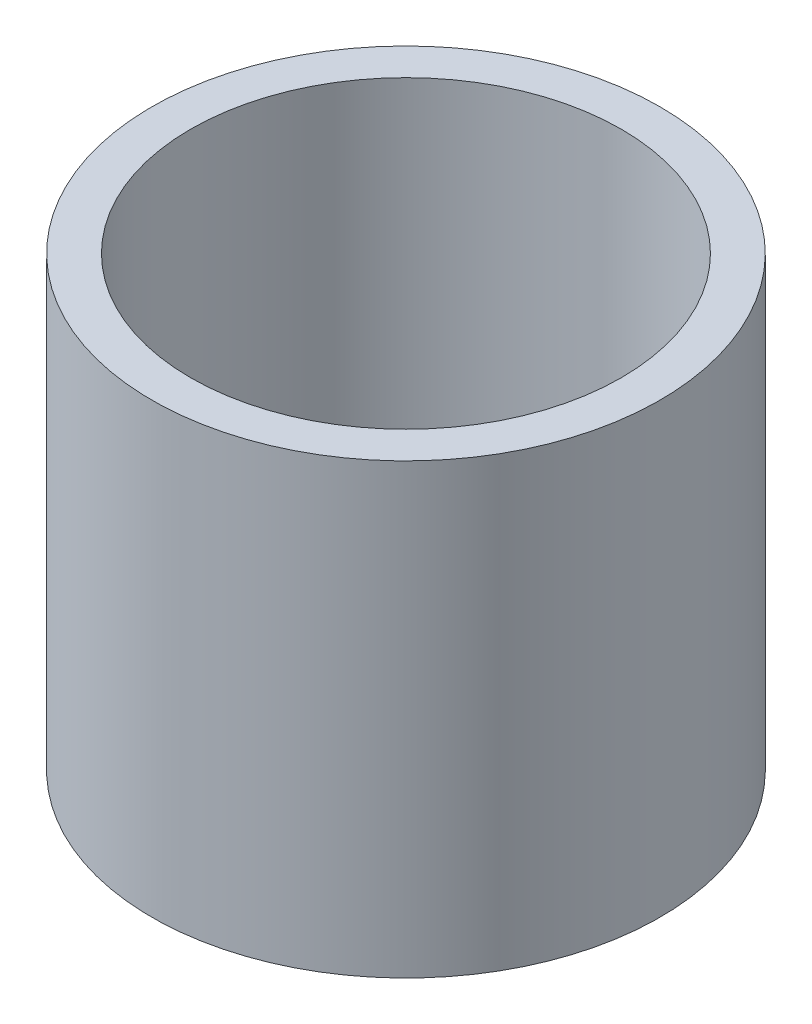
ISO-10303-21;
HEADER;
FILE_DESCRIPTION(('STEP AP214'),'2;1');
FILE_NAME('part.step','',(''),(''),'','','');
FILE_SCHEMA(('AUTOMOTIVE_DESIGN { 1 0 10303 214 1 1 1 1 }'));
ENDSEC;
DATA;
#1=APPLICATION_CONTEXT('core data for automotive mechanical design processes');
#2=APPLICATION_PROTOCOL_DEFINITION('international standard','automotive_design',2000,#1);
#3=PRODUCT_CONTEXT('',#1,'mechanical');
#4=PRODUCT('Part','Part','',(#3));
#5=PRODUCT_RELATED_PRODUCT_CATEGORY('part','',(#4));
#6=PRODUCT_DEFINITION_FORMATION('','',#4);
#7=PRODUCT_DEFINITION_CONTEXT('part definition',#1,'design');
#8=PRODUCT_DEFINITION('design','',#6,#7);
#9=PRODUCT_DEFINITION_SHAPE('','',#8);
#10=(LENGTH_UNIT() NAMED_UNIT(*) SI_UNIT(.MILLI.,.METRE.));
#11=(NAMED_UNIT(*) PLANE_ANGLE_UNIT() SI_UNIT($,.RADIAN.));
#12=(NAMED_UNIT(*) SI_UNIT($,.STERADIAN.) SOLID_ANGLE_UNIT());
#13=UNCERTAINTY_MEASURE_WITH_UNIT(LENGTH_MEASURE(1.E-05),#10,'distance_accuracy_value','');
#14=(GEOMETRIC_REPRESENTATION_CONTEXT(3) GLOBAL_UNCERTAINTY_ASSIGNED_CONTEXT((#13)) GLOBAL_UNIT_ASSIGNED_CONTEXT((#10,
#11,#12)) REPRESENTATION_CONTEXT('',''));
#15=CARTESIAN_POINT('',(0.,0.,0.));
#16=DIRECTION('',(0.,0.,1.));
#17=DIRECTION('',(1.,0.,0.));
#18=AXIS2_PLACEMENT_3D('',#15,#16,#17);
#19=CARTESIAN_POINT('',(0.,0.,0.));
#20=DIRECTION('',(0.,-1.,0.));
#21=DIRECTION('',(0.,0.,-1.));
#22=AXIS2_PLACEMENT_3D('',#19,#20,#21);
#23=CYLINDRICAL_SURFACE('',#22,29.5);
#24=CARTESIAN_POINT('',(0.,0.,0.));
#25=DIRECTION('',(0.,-1.,0.));
#26=DIRECTION('',(0.,0.,-1.));
#27=AXIS2_PLACEMENT_3D('',#24,#25,#26);
#28=CIRCLE('',#27,29.5);
#29=CARTESIAN_POINT('',(0.,0.,-29.5));
#30=VERTEX_POINT('',#29);
#31=EDGE_CURVE('E10',#30,#30,#28,.T.);
#32=ORIENTED_EDGE('',*,*,#31,.F.);
#33=EDGE_LOOP('',(#32));
#34=FACE_BOUND('',#33,.T.);
#35=CARTESIAN_POINT('',(0.,52.,0.));
#36=DIRECTION('',(0.,-1.,0.));
#37=DIRECTION('',(0.,0.,-1.));
#38=AXIS2_PLACEMENT_3D('',#35,#36,#37);
#39=CIRCLE('',#38,29.5);
#40=CARTESIAN_POINT('',(0.,52.,-29.5));
#41=VERTEX_POINT('',#40);
#42=EDGE_CURVE('E51',#41,#41,#39,.T.);
#43=ORIENTED_EDGE('',*,*,#42,.T.);
#44=EDGE_LOOP('',(#43));
#45=FACE_BOUND('',#44,.T.);
#46=ADVANCED_FACE('F37',(#34,#45),#23,.T.);
#47=CARTESIAN_POINT('',(-29.5,0.,0.));
#48=DIRECTION('',(0.,1.,0.));
#49=DIRECTION('',(0.,0.,1.));
#50=AXIS2_PLACEMENT_3D('',#47,#48,#49);
#51=PLANE('',#50);
#52=CARTESIAN_POINT('',(0.,0.,0.));
#53=DIRECTION('',(0.,-1.,0.));
#54=DIRECTION('',(0.,0.,-1.));
#55=AXIS2_PLACEMENT_3D('',#52,#53,#54);
#56=CIRCLE('',#55,25.);
#57=CARTESIAN_POINT('',(0.,0.,-25.));
#58=VERTEX_POINT('',#57);
#59=EDGE_CURVE('E43',#58,#58,#56,.T.);
#60=ORIENTED_EDGE('',*,*,#59,.F.);
#61=EDGE_LOOP('',(#60));
#62=FACE_BOUND('',#61,.T.);
#63=ORIENTED_EDGE('',*,*,#31,.T.);
#64=EDGE_LOOP('',(#63));
#65=FACE_BOUND('',#64,.T.);
#66=ADVANCED_FACE('F66',(#62,#65),#51,.F.);
#67=CARTESIAN_POINT('',(0.,0.,0.));
#68=DIRECTION('',(0.,-1.,0.));
#69=DIRECTION('',(0.,0.,-1.));
#70=AXIS2_PLACEMENT_3D('',#67,#68,#69);
#71=CYLINDRICAL_SURFACE('',#70,25.);
#72=CARTESIAN_POINT('',(0.,52.,0.));
#73=DIRECTION('',(0.,-1.,0.));
#74=DIRECTION('',(0.,0.,-1.));
#75=AXIS2_PLACEMENT_3D('',#72,#73,#74);
#76=CIRCLE('',#75,25.);
#77=CARTESIAN_POINT('',(0.,52.,-25.));
#78=VERTEX_POINT('',#77);
#79=EDGE_CURVE('E47',#78,#78,#76,.T.);
#80=ORIENTED_EDGE('',*,*,#79,.F.);
#81=EDGE_LOOP('',(#80));
#82=FACE_BOUND('',#81,.T.);
#83=ORIENTED_EDGE('',*,*,#59,.T.);
#84=EDGE_LOOP('',(#83));
#85=FACE_BOUND('',#84,.T.);
#86=ADVANCED_FACE('F61',(#82,#85),#71,.F.);
#87=CARTESIAN_POINT('',(-29.5,52.,0.));
#88=DIRECTION('',(0.,-1.,0.));
#89=DIRECTION('',(0.,0.,-1.));
#90=AXIS2_PLACEMENT_3D('',#87,#88,#89);
#91=PLANE('',#90);
#92=ORIENTED_EDGE('',*,*,#42,.F.);
#93=EDGE_LOOP('',(#92));
#94=FACE_BOUND('',#93,.T.);
#95=ORIENTED_EDGE('',*,*,#79,.T.);
#96=EDGE_LOOP('',(#95));
#97=FACE_BOUND('',#96,.T.);
#98=ADVANCED_FACE('F58',(#94,#97),#91,.F.);
#99=CLOSED_SHELL('',(#46,#66,#86,#98));
#100=MANIFOLD_SOLID_BREP('B2',#99);
#101=ADVANCED_BREP_SHAPE_REPRESENTATION('',(#18,#100),#14);
#102=SHAPE_DEFINITION_REPRESENTATION(#9,#101);
ENDSEC;
END-ISO-10303-21;
